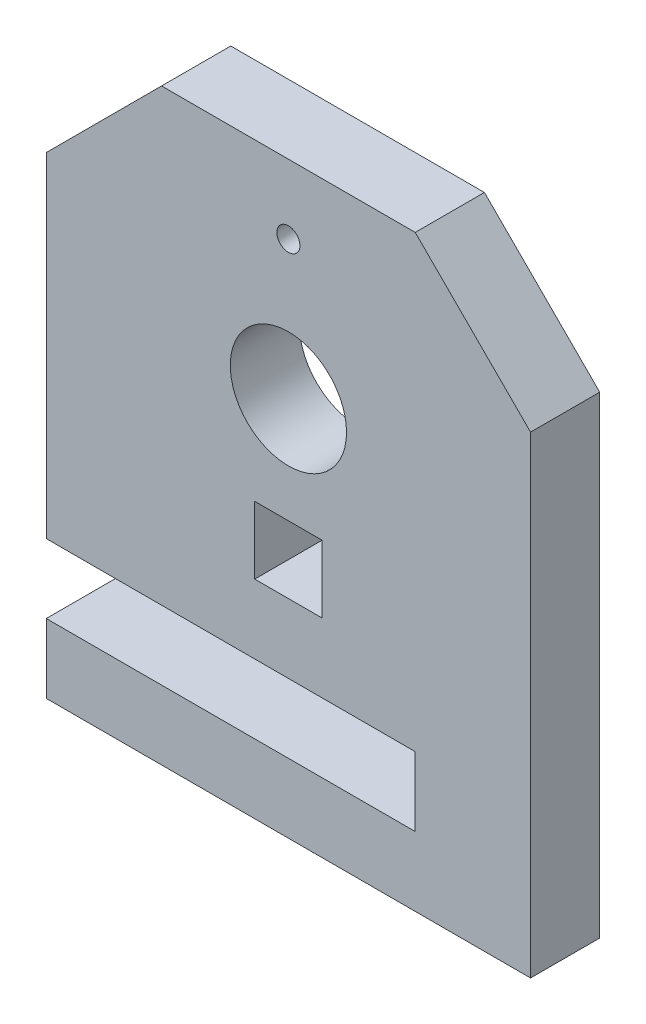
ISO-10303-21;
HEADER;
FILE_DESCRIPTION(('STEP AP214'),'2;1');
FILE_NAME('part.step','',(''),(''),'','','');
FILE_SCHEMA(('AUTOMOTIVE_DESIGN { 1 0 10303 214 1 1 1 1 }'));
ENDSEC;
DATA;
#1=APPLICATION_CONTEXT('core data for automotive mechanical design processes');
#2=APPLICATION_PROTOCOL_DEFINITION('international standard','automotive_design',2000,#1);
#3=PRODUCT_CONTEXT('',#1,'mechanical');
#4=PRODUCT('Part','Part','',(#3));
#5=PRODUCT_RELATED_PRODUCT_CATEGORY('part','',(#4));
#6=PRODUCT_DEFINITION_FORMATION('','',#4);
#7=PRODUCT_DEFINITION_CONTEXT('part definition',#1,'design');
#8=PRODUCT_DEFINITION('design','',#6,#7);
#9=PRODUCT_DEFINITION_SHAPE('','',#8);
#10=(LENGTH_UNIT() NAMED_UNIT(*) SI_UNIT(.MILLI.,.METRE.));
#11=(NAMED_UNIT(*) PLANE_ANGLE_UNIT() SI_UNIT($,.RADIAN.));
#12=(NAMED_UNIT(*) SI_UNIT($,.STERADIAN.) SOLID_ANGLE_UNIT());
#13=UNCERTAINTY_MEASURE_WITH_UNIT(LENGTH_MEASURE(1.E-05),#10,'distance_accuracy_value','');
#14=(GEOMETRIC_REPRESENTATION_CONTEXT(3) GLOBAL_UNCERTAINTY_ASSIGNED_CONTEXT((#13)) GLOBAL_UNIT_ASSIGNED_CONTEXT((#10,
#11,#12)) REPRESENTATION_CONTEXT('',''));
#15=CARTESIAN_POINT('',(0.,0.,0.));
#16=DIRECTION('',(0.,0.,1.));
#17=DIRECTION('',(1.,0.,0.));
#18=AXIS2_PLACEMENT_3D('',#15,#16,#17);
#19=CARTESIAN_POINT('',(0.,-10.7902684563758,3.));
#20=DIRECTION('',(0.,1.,0.));
#21=DIRECTION('',(0.,0.,1.));
#22=AXIS2_PLACEMENT_3D('',#19,#20,#21);
#23=PLANE('',#22);
#24=DIRECTION('',(1.,0.,0.));
#25=VECTOR('',#24,1.);
#26=CARTESIAN_POINT('',(0.,-10.7902684563758,0.));
#27=LINE('',#26,#25);
#28=CARTESIAN_POINT('',(-7.45174410038254,-10.7902684563758,0.));
#29=VERTEX_POINT('',#28);
#30=CARTESIAN_POINT('',(8.54825589961746,-10.7902684563758,0.));
#31=VERTEX_POINT('',#30);
#32=EDGE_CURVE('E191',#29,#31,#27,.T.);
#33=ORIENTED_EDGE('',*,*,#32,.F.);
#34=DIRECTION('',(0.,0.,-1.));
#35=VECTOR('',#34,1.);
#36=CARTESIAN_POINT('',(-7.45174410038254,-10.7902684563758,3.));
#37=LINE('',#36,#35);
#38=CARTESIAN_POINT('',(-7.45174410038254,-10.7902684563758,3.));
#39=VERTEX_POINT('',#38);
#40=EDGE_CURVE('E11',#39,#29,#37,.T.);
#41=ORIENTED_EDGE('',*,*,#40,.F.);
#42=DIRECTION('',(1.,0.,0.));
#43=VECTOR('',#42,1.);
#44=CARTESIAN_POINT('',(0.,-10.7902684563758,3.));
#45=LINE('',#44,#43);
#46=CARTESIAN_POINT('',(8.54825589961746,-10.7902684563758,3.));
#47=VERTEX_POINT('',#46);
#48=EDGE_CURVE('E322',#39,#47,#45,.T.);
#49=ORIENTED_EDGE('',*,*,#48,.T.);
#50=DIRECTION('',(0.,0.,-1.));
#51=VECTOR('',#50,1.);
#52=CARTESIAN_POINT('',(8.54825589961746,-10.7902684563758,3.));
#53=LINE('',#52,#51);
#54=EDGE_CURVE('E54',#47,#31,#53,.T.);
#55=ORIENTED_EDGE('',*,*,#54,.T.);
#56=EDGE_LOOP('',(#33,#41,#49,#55));
#57=FACE_BOUND('',#56,.T.);
#58=ADVANCED_FACE('F35',(#57),#23,.T.);
#59=CARTESIAN_POINT('',(-7.45174410038256,0.,3.));
#60=DIRECTION('',(1.,0.,0.));
#61=DIRECTION('',(0.,1.,0.));
#62=AXIS2_PLACEMENT_3D('',#59,#60,#61);
#63=PLANE('',#62);
#64=DIRECTION('',(0.,-1.,0.));
#65=VECTOR('',#64,1.);
#66=CARTESIAN_POINT('',(-7.45174410038256,0.,0.));
#67=LINE('',#66,#65);
#68=CARTESIAN_POINT('',(-7.45174410038254,-13.7902684563758,0.));
#69=VERTEX_POINT('',#68);
#70=EDGE_CURVE('E193',#29,#69,#67,.T.);
#71=ORIENTED_EDGE('',*,*,#70,.T.);
#72=DIRECTION('',(0.,0.,-1.));
#73=VECTOR('',#72,1.);
#74=CARTESIAN_POINT('',(-7.45174410038254,-13.7902684563758,3.));
#75=LINE('',#74,#73);
#76=CARTESIAN_POINT('',(-7.45174410038254,-13.7902684563758,3.));
#77=VERTEX_POINT('',#76);
#78=EDGE_CURVE('E45',#77,#69,#75,.T.);
#79=ORIENTED_EDGE('',*,*,#78,.F.);
#80=DIRECTION('',(0.,-1.,0.));
#81=VECTOR('',#80,1.);
#82=CARTESIAN_POINT('',(-7.45174410038256,0.,3.));
#83=LINE('',#82,#81);
#84=EDGE_CURVE('E324',#39,#77,#83,.T.);
#85=ORIENTED_EDGE('',*,*,#84,.F.);
#86=ORIENTED_EDGE('',*,*,#40,.T.);
#87=EDGE_LOOP('',(#71,#79,#85,#86));
#88=FACE_BOUND('',#87,.T.);
#89=ADVANCED_FACE('F264',(#88),#63,.F.);
#90=CARTESIAN_POINT('',(0.,-13.7902684563758,3.));
#91=DIRECTION('',(0.,1.,0.));
#92=DIRECTION('',(-1.,0.,0.));
#93=AXIS2_PLACEMENT_3D('',#90,#91,#92);
#94=PLANE('',#93);
#95=DIRECTION('',(1.,0.,0.));
#96=VECTOR('',#95,1.);
#97=CARTESIAN_POINT('',(0.,-13.7902684563758,0.));
#98=LINE('',#97,#96);
#99=CARTESIAN_POINT('',(13.5482558996175,-13.7902684563758,0.));
#100=VERTEX_POINT('',#99);
#101=EDGE_CURVE('E196',#69,#100,#98,.T.);
#102=ORIENTED_EDGE('',*,*,#101,.T.);
#103=DIRECTION('',(0.,0.,-1.));
#104=VECTOR('',#103,1.);
#105=CARTESIAN_POINT('',(13.5482558996175,-13.7902684563758,3.));
#106=LINE('',#105,#104);
#107=CARTESIAN_POINT('',(13.5482558996175,-13.7902684563758,3.));
#108=VERTEX_POINT('',#107);
#109=EDGE_CURVE('E227',#108,#100,#106,.T.);
#110=ORIENTED_EDGE('',*,*,#109,.F.);
#111=DIRECTION('',(1.,0.,0.));
#112=VECTOR('',#111,1.);
#113=CARTESIAN_POINT('',(0.,-13.7902684563758,3.));
#114=LINE('',#113,#112);
#115=EDGE_CURVE('E327',#77,#108,#114,.T.);
#116=ORIENTED_EDGE('',*,*,#115,.F.);
#117=ORIENTED_EDGE('',*,*,#78,.T.);
#118=EDGE_LOOP('',(#102,#110,#116,#117));
#119=FACE_BOUND('',#118,.T.);
#120=ADVANCED_FACE('F269',(#119),#94,.F.);
#121=CARTESIAN_POINT('',(13.5482558996175,0.,3.));
#122=DIRECTION('',(1.,0.,0.));
#123=DIRECTION('',(0.,1.,0.));
#124=AXIS2_PLACEMENT_3D('',#121,#122,#123);
#125=PLANE('',#124);
#126=DIRECTION('',(0.,-1.,0.));
#127=VECTOR('',#126,1.);
#128=CARTESIAN_POINT('',(13.5482558996175,0.,0.));
#129=LINE('',#128,#127);
#130=CARTESIAN_POINT('',(13.5482558996175,6.70973154362416,0.));
#131=VERTEX_POINT('',#130);
#132=EDGE_CURVE('E199',#131,#100,#129,.T.);
#133=ORIENTED_EDGE('',*,*,#132,.F.);
#134=DIRECTION('',(0.,0.,-1.));
#135=VECTOR('',#134,1.);
#136=CARTESIAN_POINT('',(13.5482558996175,6.70973154362416,3.));
#137=LINE('',#136,#135);
#138=CARTESIAN_POINT('',(13.5482558996175,6.70973154362416,3.));
#139=VERTEX_POINT('',#138);
#140=EDGE_CURVE('E225',#139,#131,#137,.T.);
#141=ORIENTED_EDGE('',*,*,#140,.F.);
#142=DIRECTION('',(0.,-1.,0.));
#143=VECTOR('',#142,1.);
#144=CARTESIAN_POINT('',(13.5482558996175,0.,3.));
#145=LINE('',#144,#143);
#146=EDGE_CURVE('E329',#139,#108,#145,.T.);
#147=ORIENTED_EDGE('',*,*,#146,.T.);
#148=ORIENTED_EDGE('',*,*,#109,.T.);
#149=EDGE_LOOP('',(#133,#141,#147,#148));
#150=FACE_BOUND('',#149,.T.);
#151=ADVANCED_FACE('F275',(#150),#125,.T.);
#152=CARTESIAN_POINT('',(10.1289937216208,10.1289937216208,3.));
#153=DIRECTION('',(0.707106781186547,0.707106781186548,0.));
#154=DIRECTION('',(-0.707106781186548,0.707106781186547,0.));
#155=AXIS2_PLACEMENT_3D('',#152,#153,#154);
#156=PLANE('',#155);
#157=DIRECTION('',(0.707106781186548,-0.707106781186547,0.));
#158=VECTOR('',#157,1.);
#159=CARTESIAN_POINT('',(10.1289937216208,10.1289937216208,0.));
#160=LINE('',#159,#158);
#161=CARTESIAN_POINT('',(8.54825589961746,11.7097315436242,0.));
#162=VERTEX_POINT('',#161);
#163=EDGE_CURVE('E202',#162,#131,#160,.T.);
#164=ORIENTED_EDGE('',*,*,#163,.F.);
#165=DIRECTION('',(0.,0.,-1.));
#166=VECTOR('',#165,1.);
#167=CARTESIAN_POINT('',(8.54825589961746,11.7097315436242,3.));
#168=LINE('',#167,#166);
#169=CARTESIAN_POINT('',(8.54825589961746,11.7097315436242,3.));
#170=VERTEX_POINT('',#169);
#171=EDGE_CURVE('E223',#170,#162,#168,.T.);
#172=ORIENTED_EDGE('',*,*,#171,.F.);
#173=DIRECTION('',(0.707106781186548,-0.707106781186547,0.));
#174=VECTOR('',#173,1.);
#175=CARTESIAN_POINT('',(10.1289937216208,10.1289937216208,3.));
#176=LINE('',#175,#174);
#177=EDGE_CURVE('E332',#170,#139,#176,.T.);
#178=ORIENTED_EDGE('',*,*,#177,.T.);
#179=ORIENTED_EDGE('',*,*,#140,.T.);
#180=EDGE_LOOP('',(#164,#172,#178,#179));
#181=FACE_BOUND('',#180,.T.);
#182=ADVANCED_FACE('F279',(#181),#156,.T.);
#183=CARTESIAN_POINT('',(0.,11.7097315436242,3.));
#184=DIRECTION('',(0.,1.,0.));
#185=DIRECTION('',(-1.,0.,0.));
#186=AXIS2_PLACEMENT_3D('',#183,#184,#185);
#187=PLANE('',#186);
#188=DIRECTION('',(1.,0.,0.));
#189=VECTOR('',#188,1.);
#190=CARTESIAN_POINT('',(0.,11.7097315436242,0.));
#191=LINE('',#190,#189);
#192=CARTESIAN_POINT('',(-2.45174410038254,11.7097315436242,0.));
#193=VERTEX_POINT('',#192);
#194=EDGE_CURVE('E205',#193,#162,#191,.T.);
#195=ORIENTED_EDGE('',*,*,#194,.F.);
#196=DIRECTION('',(0.,0.,-1.));
#197=VECTOR('',#196,1.);
#198=CARTESIAN_POINT('',(-2.45174410038254,11.7097315436242,3.));
#199=LINE('',#198,#197);
#200=CARTESIAN_POINT('',(-2.45174410038254,11.7097315436242,3.));
#201=VERTEX_POINT('',#200);
#202=EDGE_CURVE('E221',#201,#193,#199,.T.);
#203=ORIENTED_EDGE('',*,*,#202,.F.);
#204=DIRECTION('',(1.,0.,0.));
#205=VECTOR('',#204,1.);
#206=CARTESIAN_POINT('',(0.,11.7097315436242,3.));
#207=LINE('',#206,#205);
#208=EDGE_CURVE('E335',#201,#170,#207,.T.);
#209=ORIENTED_EDGE('',*,*,#208,.T.);
#210=ORIENTED_EDGE('',*,*,#171,.T.);
#211=EDGE_LOOP('',(#195,#203,#209,#210));
#212=FACE_BOUND('',#211,.T.);
#213=ADVANCED_FACE('F283',(#212),#187,.T.);
#214=CARTESIAN_POINT('',(-7.08073782200335,7.08073782200335,3.));
#215=DIRECTION('',(0.707106781186547,-0.707106781186547,0.));
#216=DIRECTION('',(0.707106781186548,0.707106781186548,0.));
#217=AXIS2_PLACEMENT_3D('',#214,#215,#216);
#218=PLANE('',#217);
#219=DIRECTION('',(-0.707106781186548,-0.707106781186548,0.));
#220=VECTOR('',#219,1.);
#221=CARTESIAN_POINT('',(-7.08073782200335,7.08073782200335,0.));
#222=LINE('',#221,#220);
#223=CARTESIAN_POINT('',(-7.45174410038254,6.70973154362416,0.));
#224=VERTEX_POINT('',#223);
#225=EDGE_CURVE('E208',#193,#224,#222,.T.);
#226=ORIENTED_EDGE('',*,*,#225,.T.);
#227=DIRECTION('',(0.,0.,-1.));
#228=VECTOR('',#227,1.);
#229=CARTESIAN_POINT('',(-7.45174410038254,6.70973154362416,3.));
#230=LINE('',#229,#228);
#231=CARTESIAN_POINT('',(-7.45174410038254,6.70973154362416,3.));
#232=VERTEX_POINT('',#231);
#233=EDGE_CURVE('E164',#232,#224,#230,.T.);
#234=ORIENTED_EDGE('',*,*,#233,.F.);
#235=DIRECTION('',(-0.707106781186548,-0.707106781186548,0.));
#236=VECTOR('',#235,1.);
#237=CARTESIAN_POINT('',(-7.08073782200335,7.08073782200335,3.));
#238=LINE('',#237,#236);
#239=EDGE_CURVE('E153',#201,#232,#238,.T.);
#240=ORIENTED_EDGE('',*,*,#239,.F.);
#241=ORIENTED_EDGE('',*,*,#202,.T.);
#242=EDGE_LOOP('',(#226,#234,#240,#241));
#243=FACE_BOUND('',#242,.T.);
#244=ADVANCED_FACE('F287',(#243),#218,.F.);
#245=CARTESIAN_POINT('',(-7.45174410038254,0.,3.));
#246=DIRECTION('',(1.,0.,0.));
#247=DIRECTION('',(0.,0.,-1.));
#248=AXIS2_PLACEMENT_3D('',#245,#246,#247);
#249=PLANE('',#248);
#250=DIRECTION('',(0.,-1.,0.));
#251=VECTOR('',#250,1.);
#252=CARTESIAN_POINT('',(-7.45174410038254,0.,0.));
#253=LINE('',#252,#251);
#254=CARTESIAN_POINT('',(-7.45174410038254,-7.79026845637585,0.));
#255=VERTEX_POINT('',#254);
#256=EDGE_CURVE('E161',#224,#255,#253,.T.);
#257=ORIENTED_EDGE('',*,*,#256,.T.);
#258=DIRECTION('',(0.,0.,-1.));
#259=VECTOR('',#258,1.);
#260=CARTESIAN_POINT('',(-7.45174410038254,-7.79026845637585,3.));
#261=LINE('',#260,#259);
#262=CARTESIAN_POINT('',(-7.45174410038254,-7.79026845637585,3.));
#263=VERTEX_POINT('',#262);
#264=EDGE_CURVE('E159',#263,#255,#261,.T.);
#265=ORIENTED_EDGE('',*,*,#264,.F.);
#266=DIRECTION('',(0.,-1.,0.));
#267=VECTOR('',#266,1.);
#268=CARTESIAN_POINT('',(-7.45174410038254,0.,3.));
#269=LINE('',#268,#267);
#270=EDGE_CURVE('E144',#232,#263,#269,.T.);
#271=ORIENTED_EDGE('',*,*,#270,.F.);
#272=ORIENTED_EDGE('',*,*,#233,.T.);
#273=EDGE_LOOP('',(#257,#265,#271,#272));
#274=FACE_BOUND('',#273,.T.);
#275=ADVANCED_FACE('F160',(#274),#249,.F.);
#276=CARTESIAN_POINT('',(0.,-7.79026845637585,3.));
#277=DIRECTION('',(0.,-1.,0.));
#278=DIRECTION('',(0.,0.,-1.));
#279=AXIS2_PLACEMENT_3D('',#276,#277,#278);
#280=PLANE('',#279);
#281=DIRECTION('',(-1.,0.,0.));
#282=VECTOR('',#281,1.);
#283=CARTESIAN_POINT('',(0.,-7.79026845637585,0.));
#284=LINE('',#283,#282);
#285=CARTESIAN_POINT('',(8.54825589961746,-7.79026845637585,0.));
#286=VERTEX_POINT('',#285);
#287=EDGE_CURVE('E212',#286,#255,#284,.T.);
#288=ORIENTED_EDGE('',*,*,#287,.F.);
#289=DIRECTION('',(0.,0.,-1.));
#290=VECTOR('',#289,1.);
#291=CARTESIAN_POINT('',(8.54825589961746,-7.79026845637585,3.));
#292=LINE('',#291,#290);
#293=CARTESIAN_POINT('',(8.54825589961746,-7.79026845637585,3.));
#294=VERTEX_POINT('',#293);
#295=EDGE_CURVE('E97',#294,#286,#292,.T.);
#296=ORIENTED_EDGE('',*,*,#295,.F.);
#297=DIRECTION('',(-1.,0.,0.));
#298=VECTOR('',#297,1.);
#299=CARTESIAN_POINT('',(0.,-7.79026845637585,3.));
#300=LINE('',#299,#298);
#301=EDGE_CURVE('E150',#294,#263,#300,.T.);
#302=ORIENTED_EDGE('',*,*,#301,.T.);
#303=ORIENTED_EDGE('',*,*,#264,.T.);
#304=EDGE_LOOP('',(#288,#296,#302,#303));
#305=FACE_BOUND('',#304,.T.);
#306=ADVANCED_FACE('F166',(#305),#280,.T.);
#307=CARTESIAN_POINT('',(0.,-1.87026845637584,3.));
#308=DIRECTION('',(0.,1.,0.));
#309=DIRECTION('',(-1.,0.,0.));
#310=AXIS2_PLACEMENT_3D('',#307,#308,#309);
#311=PLANE('',#310);
#312=DIRECTION('',(1.,0.,0.));
#313=VECTOR('',#312,1.);
#314=CARTESIAN_POINT('',(0.,-1.87026845637584,0.));
#315=LINE('',#314,#313);
#316=CARTESIAN_POINT('',(1.58825589961746,-1.87026845637584,0.));
#317=VERTEX_POINT('',#316);
#318=CARTESIAN_POINT('',(4.50825589961746,-1.87026845637584,0.));
#319=VERTEX_POINT('',#318);
#320=EDGE_CURVE('E179',#317,#319,#315,.T.);
#321=ORIENTED_EDGE('',*,*,#320,.T.);
#322=DIRECTION('',(0.,0.,-1.));
#323=VECTOR('',#322,1.);
#324=CARTESIAN_POINT('',(4.50825589961746,-1.87026845637584,3.));
#325=LINE('',#324,#323);
#326=CARTESIAN_POINT('',(4.50825589961746,-1.87026845637584,3.));
#327=VERTEX_POINT('',#326);
#328=EDGE_CURVE('E39',#327,#319,#325,.T.);
#329=ORIENTED_EDGE('',*,*,#328,.F.);
#330=DIRECTION('',(1.,0.,0.));
#331=VECTOR('',#330,1.);
#332=CARTESIAN_POINT('',(0.,-1.87026845637584,3.));
#333=LINE('',#332,#331);
#334=CARTESIAN_POINT('',(1.58825589961746,-1.87026845637584,3.));
#335=VERTEX_POINT('',#334);
#336=EDGE_CURVE('E313',#335,#327,#333,.T.);
#337=ORIENTED_EDGE('',*,*,#336,.F.);
#338=DIRECTION('',(0.,0.,-1.));
#339=VECTOR('',#338,1.);
#340=CARTESIAN_POINT('',(1.58825589961746,-1.87026845637584,3.));
#341=LINE('',#340,#339);
#342=EDGE_CURVE('E169',#335,#317,#341,.T.);
#343=ORIENTED_EDGE('',*,*,#342,.T.);
#344=EDGE_LOOP('',(#321,#329,#337,#343));
#345=FACE_BOUND('',#344,.T.);
#346=ADVANCED_FACE('F242',(#345),#311,.F.);
#347=CARTESIAN_POINT('',(4.50825589961746,0.,3.));
#348=DIRECTION('',(1.,0.,0.));
#349=DIRECTION('',(0.,0.,-1.));
#350=AXIS2_PLACEMENT_3D('',#347,#348,#349);
#351=PLANE('',#350);
#352=DIRECTION('',(0.,-1.,0.));
#353=VECTOR('',#352,1.);
#354=CARTESIAN_POINT('',(4.50825589961746,0.,0.));
#355=LINE('',#354,#353);
#356=CARTESIAN_POINT('',(4.50825589961746,-4.79026845637584,0.));
#357=VERTEX_POINT('',#356);
#358=EDGE_CURVE('E182',#319,#357,#355,.T.);
#359=ORIENTED_EDGE('',*,*,#358,.T.);
#360=DIRECTION('',(0.,0.,-1.));
#361=VECTOR('',#360,1.);
#362=CARTESIAN_POINT('',(4.50825589961746,-4.79026845637584,3.));
#363=LINE('',#362,#361);
#364=CARTESIAN_POINT('',(4.50825589961746,-4.79026845637584,3.));
#365=VERTEX_POINT('',#364);
#366=EDGE_CURVE('E233',#365,#357,#363,.T.);
#367=ORIENTED_EDGE('',*,*,#366,.F.);
#368=DIRECTION('',(0.,-1.,0.));
#369=VECTOR('',#368,1.);
#370=CARTESIAN_POINT('',(4.50825589961746,0.,3.));
#371=LINE('',#370,#369);
#372=EDGE_CURVE('E110',#327,#365,#371,.T.);
#373=ORIENTED_EDGE('',*,*,#372,.F.);
#374=ORIENTED_EDGE('',*,*,#328,.T.);
#375=EDGE_LOOP('',(#359,#367,#373,#374));
#376=FACE_BOUND('',#375,.T.);
#377=ADVANCED_FACE('F238',(#376),#351,.F.);
#378=CARTESIAN_POINT('',(0.,-4.79026845637584,3.));
#379=DIRECTION('',(0.,1.,0.));
#380=DIRECTION('',(-1.,0.,0.));
#381=AXIS2_PLACEMENT_3D('',#378,#379,#380);
#382=PLANE('',#381);
#383=DIRECTION('',(1.,0.,0.));
#384=VECTOR('',#383,1.);
#385=CARTESIAN_POINT('',(0.,-4.79026845637584,0.));
#386=LINE('',#385,#384);
#387=CARTESIAN_POINT('',(1.58825589961746,-4.79026845637584,0.));
#388=VERTEX_POINT('',#387);
#389=EDGE_CURVE('E185',#388,#357,#386,.T.);
#390=ORIENTED_EDGE('',*,*,#389,.F.);
#391=DIRECTION('',(0.,0.,-1.));
#392=VECTOR('',#391,1.);
#393=CARTESIAN_POINT('',(1.58825589961746,-4.79026845637584,3.));
#394=LINE('',#393,#392);
#395=CARTESIAN_POINT('',(1.58825589961746,-4.79026845637584,3.));
#396=VERTEX_POINT('',#395);
#397=EDGE_CURVE('E232',#396,#388,#394,.T.);
#398=ORIENTED_EDGE('',*,*,#397,.F.);
#399=DIRECTION('',(1.,0.,0.));
#400=VECTOR('',#399,1.);
#401=CARTESIAN_POINT('',(0.,-4.79026845637584,3.));
#402=LINE('',#401,#400);
#403=EDGE_CURVE('E315',#396,#365,#402,.T.);
#404=ORIENTED_EDGE('',*,*,#403,.T.);
#405=ORIENTED_EDGE('',*,*,#366,.T.);
#406=EDGE_LOOP('',(#390,#398,#404,#405));
#407=FACE_BOUND('',#406,.T.);
#408=ADVANCED_FACE('F253',(#407),#382,.T.);
#409=CARTESIAN_POINT('',(1.58825589961746,0.,3.));
#410=DIRECTION('',(1.,0.,0.));
#411=DIRECTION('',(0.,1.,0.));
#412=AXIS2_PLACEMENT_3D('',#409,#410,#411);
#413=PLANE('',#412);
#414=DIRECTION('',(0.,-1.,0.));
#415=VECTOR('',#414,1.);
#416=CARTESIAN_POINT('',(1.58825589961746,0.,0.));
#417=LINE('',#416,#415);
#418=EDGE_CURVE('E188',#317,#388,#417,.T.);
#419=ORIENTED_EDGE('',*,*,#418,.F.);
#420=ORIENTED_EDGE('',*,*,#342,.F.);
#421=DIRECTION('',(0.,-1.,0.));
#422=VECTOR('',#421,1.);
#423=CARTESIAN_POINT('',(1.58825589961746,0.,3.));
#424=LINE('',#423,#422);
#425=EDGE_CURVE('E251',#335,#396,#424,.T.);
#426=ORIENTED_EDGE('',*,*,#425,.T.);
#427=ORIENTED_EDGE('',*,*,#397,.T.);
#428=EDGE_LOOP('',(#419,#420,#426,#427));
#429=FACE_BOUND('',#428,.T.);
#430=ADVANCED_FACE('F248',(#429),#413,.T.);
#431=CARTESIAN_POINT('',(3.04825589961744,2.70973154362416,3.));
#432=DIRECTION('',(0.,0.,-1.));
#433=DIRECTION('',(-1.,0.,0.));
#434=AXIS2_PLACEMENT_3D('',#431,#432,#433);
#435=CYLINDRICAL_SURFACE('',#434,2.52);
#436=CARTESIAN_POINT('',(3.04825589961744,2.70973154362416,3.));
#437=DIRECTION('',(0.,0.,1.));
#438=DIRECTION('',(1.,0.,0.));
#439=AXIS2_PLACEMENT_3D('',#436,#437,#438);
#440=CIRCLE('',#439,2.52);
#441=CARTESIAN_POINT('',(5.56825589961744,2.70973154362416,3.));
#442=VERTEX_POINT('',#441);
#443=EDGE_CURVE('E312',#442,#442,#440,.T.);
#444=ORIENTED_EDGE('',*,*,#443,.T.);
#445=EDGE_LOOP('',(#444));
#446=FACE_BOUND('',#445,.T.);
#447=CARTESIAN_POINT('',(3.04825589961744,2.70973154362416,0.));
#448=DIRECTION('',(0.,0.,1.));
#449=DIRECTION('',(1.,0.,0.));
#450=AXIS2_PLACEMENT_3D('',#447,#448,#449);
#451=CIRCLE('',#450,2.52);
#452=CARTESIAN_POINT('',(5.56825589961744,2.70973154362416,0.));
#453=VERTEX_POINT('',#452);
#454=EDGE_CURVE('E176',#453,#453,#451,.T.);
#455=ORIENTED_EDGE('',*,*,#454,.F.);
#456=EDGE_LOOP('',(#455));
#457=FACE_BOUND('',#456,.T.);
#458=ADVANCED_FACE('F260',(#446,#457),#435,.F.);
#459=CARTESIAN_POINT('',(3.04825589961746,8.70973154362416,3.));
#460=DIRECTION('',(0.,0.,-1.));
#461=DIRECTION('',(-1.,0.,0.));
#462=AXIS2_PLACEMENT_3D('',#459,#460,#461);
#463=CYLINDRICAL_SURFACE('',#462,0.5);
#464=CARTESIAN_POINT('',(3.04825589961746,8.70973154362416,3.));
#465=DIRECTION('',(0.,0.,1.));
#466=DIRECTION('',(1.,0.,0.));
#467=AXIS2_PLACEMENT_3D('',#464,#465,#466);
#468=CIRCLE('',#467,0.5);
#469=CARTESIAN_POINT('',(3.54825589961746,8.70973154362416,3.));
#470=VERTEX_POINT('',#469);
#471=EDGE_CURVE('E217',#470,#470,#468,.T.);
#472=ORIENTED_EDGE('',*,*,#471,.T.);
#473=EDGE_LOOP('',(#472));
#474=FACE_BOUND('',#473,.T.);
#475=CARTESIAN_POINT('',(3.04825589961746,8.70973154362416,0.));
#476=DIRECTION('',(0.,0.,1.));
#477=DIRECTION('',(1.,0.,0.));
#478=AXIS2_PLACEMENT_3D('',#475,#476,#477);
#479=CIRCLE('',#478,0.5);
#480=CARTESIAN_POINT('',(3.54825589961746,8.70973154362416,0.));
#481=VERTEX_POINT('',#480);
#482=EDGE_CURVE('E173',#481,#481,#479,.T.);
#483=ORIENTED_EDGE('',*,*,#482,.F.);
#484=EDGE_LOOP('',(#483));
#485=FACE_BOUND('',#484,.T.);
#486=ADVANCED_FACE('F37',(#474,#485),#463,.F.);
#487=CARTESIAN_POINT('',(8.54825589961746,0.,3.));
#488=DIRECTION('',(-1.,0.,0.));
#489=DIRECTION('',(0.,0.,1.));
#490=AXIS2_PLACEMENT_3D('',#487,#488,#489);
#491=PLANE('',#490);
#492=DIRECTION('',(0.,1.,0.));
#493=VECTOR('',#492,1.);
#494=CARTESIAN_POINT('',(8.54825589961746,0.,0.));
#495=LINE('',#494,#493);
#496=EDGE_CURVE('E214',#31,#286,#495,.T.);
#497=ORIENTED_EDGE('',*,*,#496,.F.);
#498=ORIENTED_EDGE('',*,*,#54,.F.);
#499=DIRECTION('',(0.,1.,0.));
#500=VECTOR('',#499,1.);
#501=CARTESIAN_POINT('',(8.54825589961746,0.,3.));
#502=LINE('',#501,#500);
#503=EDGE_CURVE('E167',#47,#294,#502,.T.);
#504=ORIENTED_EDGE('',*,*,#503,.T.);
#505=ORIENTED_EDGE('',*,*,#295,.T.);
#506=EDGE_LOOP('',(#497,#498,#504,#505));
#507=FACE_BOUND('',#506,.T.);
#508=ADVANCED_FACE('F296',(#507),#491,.T.);
#509=CARTESIAN_POINT('',(0.,0.,3.));
#510=DIRECTION('',(0.,0.,1.));
#511=DIRECTION('',(1.,0.,0.));
#512=AXIS2_PLACEMENT_3D('',#509,#510,#511);
#513=PLANE('',#512);
#514=ORIENTED_EDGE('',*,*,#471,.F.);
#515=EDGE_LOOP('',(#514));
#516=FACE_BOUND('',#515,.T.);
#517=ORIENTED_EDGE('',*,*,#443,.F.);
#518=EDGE_LOOP('',(#517));
#519=FACE_BOUND('',#518,.T.);
#520=ORIENTED_EDGE('',*,*,#336,.T.);
#521=ORIENTED_EDGE('',*,*,#372,.T.);
#522=ORIENTED_EDGE('',*,*,#403,.F.);
#523=ORIENTED_EDGE('',*,*,#425,.F.);
#524=EDGE_LOOP('',(#520,#521,#522,#523));
#525=FACE_BOUND('',#524,.T.);
#526=ORIENTED_EDGE('',*,*,#48,.F.);
#527=ORIENTED_EDGE('',*,*,#84,.T.);
#528=ORIENTED_EDGE('',*,*,#115,.T.);
#529=ORIENTED_EDGE('',*,*,#146,.F.);
#530=ORIENTED_EDGE('',*,*,#177,.F.);
#531=ORIENTED_EDGE('',*,*,#208,.F.);
#532=ORIENTED_EDGE('',*,*,#239,.T.);
#533=ORIENTED_EDGE('',*,*,#270,.T.);
#534=ORIENTED_EDGE('',*,*,#301,.F.);
#535=ORIENTED_EDGE('',*,*,#503,.F.);
#536=EDGE_LOOP('',(#526,#527,#528,#529,#530,#531,#532,#533,#534,#535));
#537=FACE_BOUND('',#536,.T.);
#538=ADVANCED_FACE('F147',(#516,#519,#525,#537),#513,.T.);
#539=CARTESIAN_POINT('',(0.,0.,0.));
#540=DIRECTION('',(0.,0.,1.));
#541=DIRECTION('',(1.,0.,0.));
#542=AXIS2_PLACEMENT_3D('',#539,#540,#541);
#543=PLANE('',#542);
#544=ORIENTED_EDGE('',*,*,#482,.T.);
#545=EDGE_LOOP('',(#544));
#546=FACE_BOUND('',#545,.T.);
#547=ORIENTED_EDGE('',*,*,#454,.T.);
#548=EDGE_LOOP('',(#547));
#549=FACE_BOUND('',#548,.T.);
#550=ORIENTED_EDGE('',*,*,#320,.F.);
#551=ORIENTED_EDGE('',*,*,#418,.T.);
#552=ORIENTED_EDGE('',*,*,#389,.T.);
#553=ORIENTED_EDGE('',*,*,#358,.F.);
#554=EDGE_LOOP('',(#550,#551,#552,#553));
#555=FACE_BOUND('',#554,.T.);
#556=ORIENTED_EDGE('',*,*,#32,.T.);
#557=ORIENTED_EDGE('',*,*,#496,.T.);
#558=ORIENTED_EDGE('',*,*,#287,.T.);
#559=ORIENTED_EDGE('',*,*,#256,.F.);
#560=ORIENTED_EDGE('',*,*,#225,.F.);
#561=ORIENTED_EDGE('',*,*,#194,.T.);
#562=ORIENTED_EDGE('',*,*,#163,.T.);
#563=ORIENTED_EDGE('',*,*,#132,.T.);
#564=ORIENTED_EDGE('',*,*,#101,.F.);
#565=ORIENTED_EDGE('',*,*,#70,.F.);
#566=EDGE_LOOP('',(#556,#557,#558,#559,#560,#561,#562,#563,#564,#565));
#567=FACE_BOUND('',#566,.T.);
#568=ADVANCED_FACE('F245',(#546,#549,#555,#567),#543,.F.);
#569=CLOSED_SHELL('',(#58,#89,#120,#151,#182,#213,#244,#275,#306,#346,#377,#408,#430,#458,#486,
#508,#538,#568));
#570=MANIFOLD_SOLID_BREP('B2',#569);
#571=ADVANCED_BREP_SHAPE_REPRESENTATION('',(#18,#570),#14);
#572=SHAPE_DEFINITION_REPRESENTATION(#9,#571);
ENDSEC;
END-ISO-10303-21;
